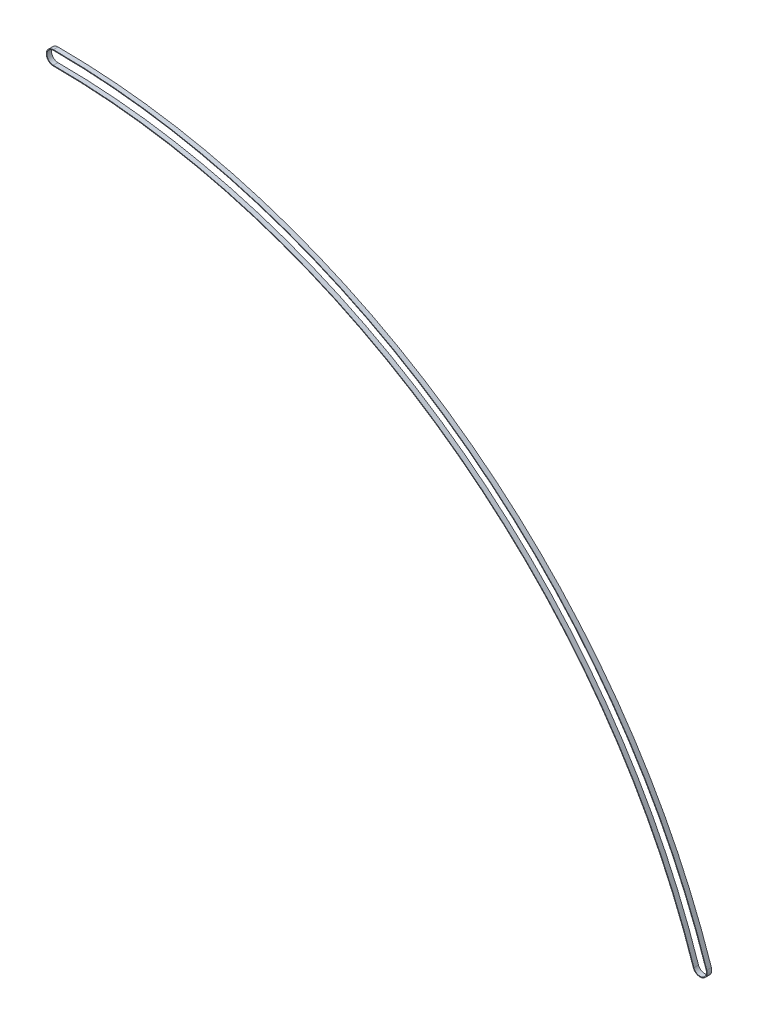
ISO-10303-21;
HEADER;
FILE_DESCRIPTION(('STEP AP214'),'2;1');
FILE_NAME('part.step','',(''),(''),'','','');
FILE_SCHEMA(('AUTOMOTIVE_DESIGN { 1 0 10303 214 1 1 1 1 }'));
ENDSEC;
DATA;
#1=APPLICATION_CONTEXT('core data for automotive mechanical design processes');
#2=APPLICATION_PROTOCOL_DEFINITION('international standard','automotive_design',2000,#1);
#3=PRODUCT_CONTEXT('',#1,'mechanical');
#4=PRODUCT('Part','Part','',(#3));
#5=PRODUCT_RELATED_PRODUCT_CATEGORY('part','',(#4));
#6=PRODUCT_DEFINITION_FORMATION('','',#4);
#7=PRODUCT_DEFINITION_CONTEXT('part definition',#1,'design');
#8=PRODUCT_DEFINITION('design','',#6,#7);
#9=PRODUCT_DEFINITION_SHAPE('','',#8);
#10=(LENGTH_UNIT() NAMED_UNIT(*) SI_UNIT(.MILLI.,.METRE.));
#11=(NAMED_UNIT(*) PLANE_ANGLE_UNIT() SI_UNIT($,.RADIAN.));
#12=(NAMED_UNIT(*) SI_UNIT($,.STERADIAN.) SOLID_ANGLE_UNIT());
#13=UNCERTAINTY_MEASURE_WITH_UNIT(LENGTH_MEASURE(1.E-05),#10,'distance_accuracy_value','');
#14=(GEOMETRIC_REPRESENTATION_CONTEXT(3) GLOBAL_UNCERTAINTY_ASSIGNED_CONTEXT((#13)) GLOBAL_UNIT_ASSIGNED_CONTEXT((#10,
#11,#12)) REPRESENTATION_CONTEXT('',''));
#15=CARTESIAN_POINT('',(0.,0.,0.));
#16=DIRECTION('',(0.,0.,1.));
#17=DIRECTION('',(1.,0.,0.));
#18=AXIS2_PLACEMENT_3D('',#15,#16,#17);
#19=CARTESIAN_POINT('',(0.,0.,10.));
#20=DIRECTION('',(0.,0.,-1.));
#21=DIRECTION('',(-1.,0.,0.));
#22=AXIS2_PLACEMENT_3D('',#19,#20,#21);
#23=CYLINDRICAL_SURFACE('',#22,1464.65);
#24=CARTESIAN_POINT('',(0.,0.,0.));
#25=DIRECTION('',(0.,0.,1.));
#26=DIRECTION('',(1.,0.,0.));
#27=AXIS2_PLACEMENT_3D('',#24,#25,#26);
#28=CIRCLE('',#27,1464.65);
#29=CARTESIAN_POINT('',(1389.52899220187,463.042981083231,0.));
#30=VERTEX_POINT('',#29);
#31=CARTESIAN_POINT('',(-1.53377761303083,1464.64919691585,0.));
#32=VERTEX_POINT('',#31);
#33=EDGE_CURVE('E153',#30,#32,#28,.T.);
#34=ORIENTED_EDGE('',*,*,#33,.F.);
#35=DIRECTION('',(0.,0.,-1.));
#36=VECTOR('',#35,1.);
#37=CARTESIAN_POINT('',(1389.52899220187,463.042981083231,10.));
#38=LINE('',#37,#36);
#39=CARTESIAN_POINT('',(1389.52899220187,463.042981083231,10.));
#40=VERTEX_POINT('',#39);
#41=EDGE_CURVE('E12',#40,#30,#38,.T.);
#42=ORIENTED_EDGE('',*,*,#41,.F.);
#43=CARTESIAN_POINT('',(0.,0.,10.));
#44=DIRECTION('',(0.,0.,1.));
#45=DIRECTION('',(1.,0.,0.));
#46=AXIS2_PLACEMENT_3D('',#43,#44,#45);
#47=CIRCLE('',#46,1464.65);
#48=CARTESIAN_POINT('',(-1.53377761303083,1464.64919691585,10.));
#49=VERTEX_POINT('',#48);
#50=EDGE_CURVE('E157',#40,#49,#47,.T.);
#51=ORIENTED_EDGE('',*,*,#50,.T.);
#52=DIRECTION('',(0.,0.,-1.));
#53=VECTOR('',#52,1.);
#54=CARTESIAN_POINT('',(-1.53377761303083,1464.64919691585,10.));
#55=LINE('',#54,#53);
#56=EDGE_CURVE('E60',#49,#32,#55,.T.);
#57=ORIENTED_EDGE('',*,*,#56,.T.);
#58=EDGE_LOOP('',(#34,#42,#51,#57));
#59=FACE_BOUND('',#58,.T.);
#60=ADVANCED_FACE('F57',(#59),#23,.F.);
#61=CARTESIAN_POINT('',(1404.23400662793,467.943241354825,10.));
#62=DIRECTION('',(0.,0.,-1.));
#63=DIRECTION('',(-1.,0.,0.));
#64=AXIS2_PLACEMENT_3D('',#61,#62,#63);
#65=CYLINDRICAL_SURFACE('',#64,15.5000000000001);
#66=CARTESIAN_POINT('',(1404.23400662793,467.943241354825,0.));
#67=DIRECTION('',(0.,0.,1.));
#68=DIRECTION('',(1.,0.,0.));
#69=AXIS2_PLACEMENT_3D('',#66,#67,#68);
#70=CIRCLE('',#69,15.5000000000001);
#71=CARTESIAN_POINT('',(1418.93902105399,472.843501626419,0.));
#72=VERTEX_POINT('',#71);
#73=EDGE_CURVE('E161',#30,#72,#70,.T.);
#74=ORIENTED_EDGE('',*,*,#73,.T.);
#75=DIRECTION('',(0.,0.,-1.));
#76=VECTOR('',#75,1.);
#77=CARTESIAN_POINT('',(1418.93902105399,472.843501626419,10.));
#78=LINE('',#77,#76);
#79=CARTESIAN_POINT('',(1418.93902105399,472.843501626419,10.));
#80=VERTEX_POINT('',#79);
#81=EDGE_CURVE('E65',#80,#72,#78,.T.);
#82=ORIENTED_EDGE('',*,*,#81,.F.);
#83=CARTESIAN_POINT('',(1404.23400662793,467.943241354825,10.));
#84=DIRECTION('',(0.,0.,1.));
#85=DIRECTION('',(1.,0.,0.));
#86=AXIS2_PLACEMENT_3D('',#83,#84,#85);
#87=CIRCLE('',#86,15.5000000000001);
#88=EDGE_CURVE('E165',#40,#80,#87,.T.);
#89=ORIENTED_EDGE('',*,*,#88,.F.);
#90=ORIENTED_EDGE('',*,*,#41,.T.);
#91=EDGE_LOOP('',(#74,#82,#89,#90));
#92=FACE_BOUND('',#91,.T.);
#93=ADVANCED_FACE('F193',(#92),#65,.T.);
#94=CARTESIAN_POINT('',(0.,0.,10.));
#95=DIRECTION('',(0.,0.,-1.));
#96=DIRECTION('',(-1.,0.,0.));
#97=AXIS2_PLACEMENT_3D('',#94,#95,#96);
#98=CYLINDRICAL_SURFACE('',#97,1495.65);
#99=CARTESIAN_POINT('',(0.,0.,0.));
#100=DIRECTION('',(0.,0.,1.));
#101=DIRECTION('',(1.,0.,0.));
#102=AXIS2_PLACEMENT_3D('',#99,#100,#101);
#103=CIRCLE('',#102,1495.65);
#104=CARTESIAN_POINT('',(-1.56624073118462,1495.6491799182,0.));
#105=VERTEX_POINT('',#104);
#106=EDGE_CURVE('E172',#72,#105,#103,.T.);
#107=ORIENTED_EDGE('',*,*,#106,.T.);
#108=DIRECTION('',(0.,0.,-1.));
#109=VECTOR('',#108,1.);
#110=CARTESIAN_POINT('',(-1.56624073118462,1495.6491799182,10.));
#111=LINE('',#110,#109);
#112=CARTESIAN_POINT('',(-1.56624073118462,1495.6491799182,10.));
#113=VERTEX_POINT('',#112);
#114=EDGE_CURVE('E176',#113,#105,#111,.T.);
#115=ORIENTED_EDGE('',*,*,#114,.F.);
#116=CARTESIAN_POINT('',(0.,0.,10.));
#117=DIRECTION('',(0.,0.,1.));
#118=DIRECTION('',(1.,0.,0.));
#119=AXIS2_PLACEMENT_3D('',#116,#117,#118);
#120=CIRCLE('',#119,1495.65);
#121=EDGE_CURVE('E163',#80,#113,#120,.T.);
#122=ORIENTED_EDGE('',*,*,#121,.F.);
#123=ORIENTED_EDGE('',*,*,#81,.T.);
#124=EDGE_LOOP('',(#107,#115,#122,#123));
#125=FACE_BOUND('',#124,.T.);
#126=ADVANCED_FACE('F197',(#125),#98,.T.);
#127=CARTESIAN_POINT('',(-1.550009172108,1480.14918841702,10.));
#128=DIRECTION('',(0.,0.,-1.));
#129=DIRECTION('',(-1.,0.,0.));
#130=AXIS2_PLACEMENT_3D('',#127,#128,#129);
#131=CYLINDRICAL_SURFACE('',#130,15.4999999999981);
#132=CARTESIAN_POINT('',(-1.550009172108,1480.14918841702,0.));
#133=DIRECTION('',(0.,0.,1.));
#134=DIRECTION('',(1.,0.,0.));
#135=AXIS2_PLACEMENT_3D('',#132,#133,#134);
#136=CIRCLE('',#135,15.4999999999981);
#137=EDGE_CURVE('E169',#105,#32,#136,.T.);
#138=ORIENTED_EDGE('',*,*,#137,.T.);
#139=ORIENTED_EDGE('',*,*,#56,.F.);
#140=CARTESIAN_POINT('',(-1.550009172108,1480.14918841702,10.));
#141=DIRECTION('',(0.,0.,1.));
#142=DIRECTION('',(1.,0.,0.));
#143=AXIS2_PLACEMENT_3D('',#140,#141,#142);
#144=CIRCLE('',#143,15.4999999999981);
#145=EDGE_CURVE('E160',#113,#49,#144,.T.);
#146=ORIENTED_EDGE('',*,*,#145,.F.);
#147=ORIENTED_EDGE('',*,*,#114,.T.);
#148=EDGE_LOOP('',(#138,#139,#146,#147));
#149=FACE_BOUND('',#148,.T.);
#150=ADVANCED_FACE('F186',(#149),#131,.T.);
#151=CARTESIAN_POINT('',(-0.775004586053998,740.074594208511,10.));
#152=DIRECTION('',(0.,0.,1.));
#153=DIRECTION('',(1.,0.,0.));
#154=AXIS2_PLACEMENT_3D('',#151,#152,#153);
#155=PLANE('',#154);
#156=CARTESIAN_POINT('',(0.,0.,10.));
#157=DIRECTION('',(0.,0.,1.));
#158=DIRECTION('',(1.,0.,0.));
#159=AXIS2_PLACEMENT_3D('',#156,#157,#158);
#160=CIRCLE('',#159,1466.15);
#161=CARTESIAN_POINT('',(1390.95205811407,463.517199819192,10.));
#162=VERTEX_POINT('',#161);
#163=CARTESIAN_POINT('',(-1.53534840907067,1466.14919609338,10.));
#164=VERTEX_POINT('',#163);
#165=EDGE_CURVE('E129',#162,#164,#160,.T.);
#166=ORIENTED_EDGE('',*,*,#165,.T.);
#167=CARTESIAN_POINT('',(-1.550009172108,1480.14918841702,10.));
#168=DIRECTION('',(0.,0.,1.));
#169=DIRECTION('',(1.,0.,0.));
#170=AXIS2_PLACEMENT_3D('',#167,#168,#169);
#171=CIRCLE('',#170,13.9999999999981);
#172=CARTESIAN_POINT('',(-1.56466993514507,1494.14918074066,10.));
#173=VERTEX_POINT('',#172);
#174=EDGE_CURVE('E121',#173,#164,#171,.T.);
#175=ORIENTED_EDGE('',*,*,#174,.F.);
#176=CARTESIAN_POINT('',(0.,0.,10.));
#177=DIRECTION('',(0.,0.,1.));
#178=DIRECTION('',(1.,0.,0.));
#179=AXIS2_PLACEMENT_3D('',#176,#177,#178);
#180=CIRCLE('',#179,1494.15);
#181=CARTESIAN_POINT('',(1417.51595514179,472.369282890458,10.));
#182=VERTEX_POINT('',#181);
#183=EDGE_CURVE('E128',#182,#173,#180,.T.);
#184=ORIENTED_EDGE('',*,*,#183,.F.);
#185=CARTESIAN_POINT('',(1404.23400662793,467.943241354825,10.));
#186=DIRECTION('',(0.,0.,1.));
#187=DIRECTION('',(1.,0.,0.));
#188=AXIS2_PLACEMENT_3D('',#185,#186,#187);
#189=CIRCLE('',#188,14.0000000000001);
#190=EDGE_CURVE('E134',#162,#182,#189,.T.);
#191=ORIENTED_EDGE('',*,*,#190,.F.);
#192=EDGE_LOOP('',(#166,#175,#184,#191));
#193=FACE_BOUND('',#192,.T.);
#194=ORIENTED_EDGE('',*,*,#50,.F.);
#195=ORIENTED_EDGE('',*,*,#88,.T.);
#196=ORIENTED_EDGE('',*,*,#121,.T.);
#197=ORIENTED_EDGE('',*,*,#145,.T.);
#198=EDGE_LOOP('',(#194,#195,#196,#197));
#199=FACE_BOUND('',#198,.T.);
#200=ADVANCED_FACE('F136',(#193,#199),#155,.T.);
#201=CARTESIAN_POINT('',(-0.775004586053998,740.074594208511,0.));
#202=DIRECTION('',(0.,0.,1.));
#203=DIRECTION('',(1.,0.,0.));
#204=AXIS2_PLACEMENT_3D('',#201,#202,#203);
#205=PLANE('',#204);
#206=CARTESIAN_POINT('',(-1.550009172108,1480.14918841702,0.));
#207=DIRECTION('',(0.,0.,1.));
#208=DIRECTION('',(1.,0.,0.));
#209=AXIS2_PLACEMENT_3D('',#206,#207,#208);
#210=CIRCLE('',#209,13.9999999999981);
#211=CARTESIAN_POINT('',(-1.56466993514507,1494.14918074066,0.));
#212=VERTEX_POINT('',#211);
#213=CARTESIAN_POINT('',(-1.53534840907068,1466.14919609338,0.));
#214=VERTEX_POINT('',#213);
#215=EDGE_CURVE('E147',#212,#214,#210,.T.);
#216=ORIENTED_EDGE('',*,*,#215,.T.);
#217=CARTESIAN_POINT('',(0.,0.,0.));
#218=DIRECTION('',(0.,0.,1.));
#219=DIRECTION('',(1.,0.,0.));
#220=AXIS2_PLACEMENT_3D('',#217,#218,#219);
#221=CIRCLE('',#220,1466.15);
#222=CARTESIAN_POINT('',(1390.95205811407,463.517199819192,0.));
#223=VERTEX_POINT('',#222);
#224=EDGE_CURVE('E81',#223,#214,#221,.T.);
#225=ORIENTED_EDGE('',*,*,#224,.F.);
#226=CARTESIAN_POINT('',(1404.23400662793,467.943241354825,0.));
#227=DIRECTION('',(0.,0.,1.));
#228=DIRECTION('',(1.,0.,0.));
#229=AXIS2_PLACEMENT_3D('',#226,#227,#228);
#230=CIRCLE('',#229,14.0000000000001);
#231=CARTESIAN_POINT('',(1417.51595514179,472.369282890458,0.));
#232=VERTEX_POINT('',#231);
#233=EDGE_CURVE('E138',#223,#232,#230,.T.);
#234=ORIENTED_EDGE('',*,*,#233,.T.);
#235=CARTESIAN_POINT('',(0.,0.,0.));
#236=DIRECTION('',(0.,0.,1.));
#237=DIRECTION('',(1.,0.,0.));
#238=AXIS2_PLACEMENT_3D('',#235,#236,#237);
#239=CIRCLE('',#238,1494.15);
#240=EDGE_CURVE('E141',#232,#212,#239,.T.);
#241=ORIENTED_EDGE('',*,*,#240,.T.);
#242=EDGE_LOOP('',(#216,#225,#234,#241));
#243=FACE_BOUND('',#242,.T.);
#244=ORIENTED_EDGE('',*,*,#33,.T.);
#245=ORIENTED_EDGE('',*,*,#137,.F.);
#246=ORIENTED_EDGE('',*,*,#106,.F.);
#247=ORIENTED_EDGE('',*,*,#73,.F.);
#248=EDGE_LOOP('',(#244,#245,#246,#247));
#249=FACE_BOUND('',#248,.T.);
#250=ADVANCED_FACE('F190',(#243,#249),#205,.F.);
#251=CARTESIAN_POINT('',(0.,0.,10.));
#252=DIRECTION('',(0.,0.,-1.));
#253=DIRECTION('',(-1.,0.,0.));
#254=AXIS2_PLACEMENT_3D('',#251,#252,#253);
#255=CYLINDRICAL_SURFACE('',#254,1466.15);
#256=ORIENTED_EDGE('',*,*,#224,.T.);
#257=DIRECTION('',(0.,0.,-1.));
#258=VECTOR('',#257,1.);
#259=CARTESIAN_POINT('',(-1.53534840907067,1466.14919609338,10.));
#260=LINE('',#259,#258);
#261=EDGE_CURVE('E123',#164,#214,#260,.T.);
#262=ORIENTED_EDGE('',*,*,#261,.F.);
#263=ORIENTED_EDGE('',*,*,#165,.F.);
#264=DIRECTION('',(0.,0.,-1.));
#265=VECTOR('',#264,1.);
#266=CARTESIAN_POINT('',(1390.95205811407,463.517199819192,10.));
#267=LINE('',#266,#265);
#268=EDGE_CURVE('E151',#162,#223,#267,.T.);
#269=ORIENTED_EDGE('',*,*,#268,.T.);
#270=EDGE_LOOP('',(#256,#262,#263,#269));
#271=FACE_BOUND('',#270,.T.);
#272=ADVANCED_FACE('F132',(#271),#255,.T.);
#273=CARTESIAN_POINT('',(1404.23400662793,467.943241354825,10.));
#274=DIRECTION('',(0.,0.,-1.));
#275=DIRECTION('',(-1.,0.,0.));
#276=AXIS2_PLACEMENT_3D('',#273,#274,#275);
#277=CYLINDRICAL_SURFACE('',#276,14.0000000000001);
#278=ORIENTED_EDGE('',*,*,#233,.F.);
#279=ORIENTED_EDGE('',*,*,#268,.F.);
#280=ORIENTED_EDGE('',*,*,#190,.T.);
#281=DIRECTION('',(0.,0.,-1.));
#282=VECTOR('',#281,1.);
#283=CARTESIAN_POINT('',(1417.51595514179,472.369282890458,10.));
#284=LINE('',#283,#282);
#285=EDGE_CURVE('E154',#182,#232,#284,.T.);
#286=ORIENTED_EDGE('',*,*,#285,.T.);
#287=EDGE_LOOP('',(#278,#279,#280,#286));
#288=FACE_BOUND('',#287,.T.);
#289=ADVANCED_FACE('F241',(#288),#277,.F.);
#290=CARTESIAN_POINT('',(0.,0.,10.));
#291=DIRECTION('',(0.,0.,-1.));
#292=DIRECTION('',(-1.,0.,0.));
#293=AXIS2_PLACEMENT_3D('',#290,#291,#292);
#294=CYLINDRICAL_SURFACE('',#293,1494.15);
#295=ORIENTED_EDGE('',*,*,#240,.F.);
#296=ORIENTED_EDGE('',*,*,#285,.F.);
#297=ORIENTED_EDGE('',*,*,#183,.T.);
#298=DIRECTION('',(0.,0.,-1.));
#299=VECTOR('',#298,1.);
#300=CARTESIAN_POINT('',(-1.56466993514507,1494.14918074066,10.));
#301=LINE('',#300,#299);
#302=EDGE_CURVE('E73',#173,#212,#301,.T.);
#303=ORIENTED_EDGE('',*,*,#302,.T.);
#304=EDGE_LOOP('',(#295,#296,#297,#303));
#305=FACE_BOUND('',#304,.T.);
#306=ADVANCED_FACE('F249',(#305),#294,.F.);
#307=CARTESIAN_POINT('',(-1.550009172108,1480.14918841702,10.));
#308=DIRECTION('',(0.,0.,-1.));
#309=DIRECTION('',(-1.,0.,0.));
#310=AXIS2_PLACEMENT_3D('',#307,#308,#309);
#311=CYLINDRICAL_SURFACE('',#310,13.9999999999981);
#312=ORIENTED_EDGE('',*,*,#215,.F.);
#313=ORIENTED_EDGE('',*,*,#302,.F.);
#314=ORIENTED_EDGE('',*,*,#174,.T.);
#315=ORIENTED_EDGE('',*,*,#261,.T.);
#316=EDGE_LOOP('',(#312,#313,#314,#315));
#317=FACE_BOUND('',#316,.T.);
#318=ADVANCED_FACE('F122',(#317),#311,.F.);
#319=CLOSED_SHELL('',(#60,#93,#126,#150,#200,#250,#272,#289,#306,#318));
#320=MANIFOLD_SOLID_BREP('B2',#319);
#321=ADVANCED_BREP_SHAPE_REPRESENTATION('',(#18,#320),#14);
#322=SHAPE_DEFINITION_REPRESENTATION(#9,#321);
ENDSEC;
END-ISO-10303-21;
